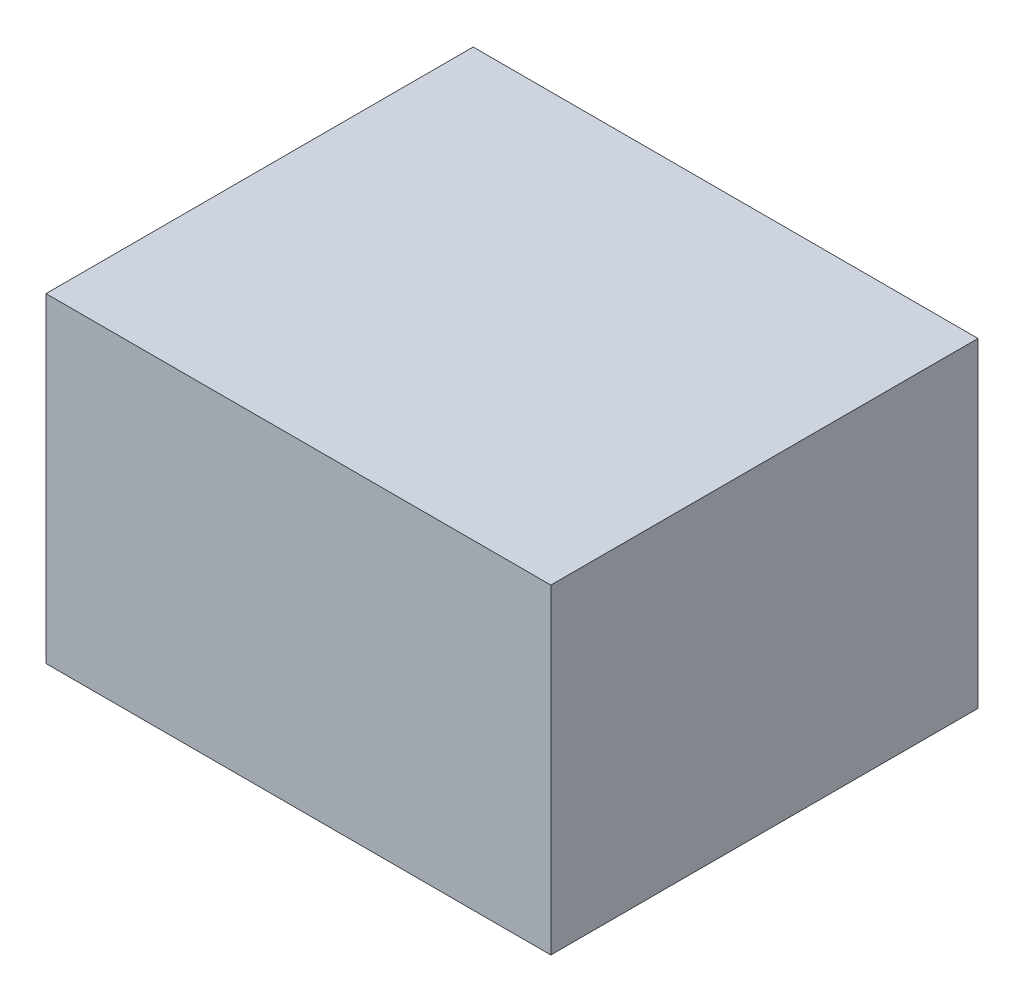
ISO-10303-21;
HEADER;
FILE_DESCRIPTION(('STEP AP214'),'2;1');
FILE_NAME('part.step','',(''),(''),'','','');
FILE_SCHEMA(('AUTOMOTIVE_DESIGN { 1 0 10303 214 1 1 1 1 }'));
ENDSEC;
DATA;
#1=APPLICATION_CONTEXT('core data for automotive mechanical design processes');
#2=APPLICATION_PROTOCOL_DEFINITION('international standard','automotive_design',2000,#1);
#3=PRODUCT_CONTEXT('',#1,'mechanical');
#4=PRODUCT('Part','Part','',(#3));
#5=PRODUCT_RELATED_PRODUCT_CATEGORY('part','',(#4));
#6=PRODUCT_DEFINITION_FORMATION('','',#4);
#7=PRODUCT_DEFINITION_CONTEXT('part definition',#1,'design');
#8=PRODUCT_DEFINITION('design','',#6,#7);
#9=PRODUCT_DEFINITION_SHAPE('','',#8);
#10=(LENGTH_UNIT() NAMED_UNIT(*) SI_UNIT(.MILLI.,.METRE.));
#11=(NAMED_UNIT(*) PLANE_ANGLE_UNIT() SI_UNIT($,.RADIAN.));
#12=(NAMED_UNIT(*) SI_UNIT($,.STERADIAN.) SOLID_ANGLE_UNIT());
#13=UNCERTAINTY_MEASURE_WITH_UNIT(LENGTH_MEASURE(1.E-05),#10,'distance_accuracy_value','');
#14=(GEOMETRIC_REPRESENTATION_CONTEXT(3) GLOBAL_UNCERTAINTY_ASSIGNED_CONTEXT((#13)) GLOBAL_UNIT_ASSIGNED_CONTEXT((#10,
#11,#12)) REPRESENTATION_CONTEXT('',''));
#15=CARTESIAN_POINT('',(0.,0.,0.));
#16=DIRECTION('',(0.,0.,1.));
#17=DIRECTION('',(1.,0.,0.));
#18=AXIS2_PLACEMENT_3D('',#15,#16,#17);
#19=CARTESIAN_POINT('',(0.,4.191,0.));
#20=DIRECTION('',(1.,0.,0.));
#21=DIRECTION('',(0.,0.,-1.));
#22=AXIS2_PLACEMENT_3D('',#19,#20,#21);
#23=PLANE('',#22);
#24=DIRECTION('',(0.,0.,1.));
#25=VECTOR('',#24,1.);
#26=CARTESIAN_POINT('',(0.,0.,0.));
#27=LINE('',#26,#25);
#28=CARTESIAN_POINT('',(0.,0.,-5.588));
#29=VERTEX_POINT('',#28);
#30=CARTESIAN_POINT('',(0.,0.,0.));
#31=VERTEX_POINT('',#30);
#32=EDGE_CURVE('E73',#29,#31,#27,.T.);
#33=ORIENTED_EDGE('',*,*,#32,.T.);
#34=DIRECTION('',(0.,-1.,0.));
#35=VECTOR('',#34,1.);
#36=CARTESIAN_POINT('',(0.,4.191,0.));
#37=LINE('',#36,#35);
#38=CARTESIAN_POINT('',(0.,4.191,0.));
#39=VERTEX_POINT('',#38);
#40=EDGE_CURVE('E11',#39,#31,#37,.T.);
#41=ORIENTED_EDGE('',*,*,#40,.F.);
#42=DIRECTION('',(0.,0.,1.));
#43=VECTOR('',#42,1.);
#44=CARTESIAN_POINT('',(0.,4.191,0.));
#45=LINE('',#44,#43);
#46=CARTESIAN_POINT('',(0.,4.191,-5.588));
#47=VERTEX_POINT('',#46);
#48=EDGE_CURVE('E91',#47,#39,#45,.T.);
#49=ORIENTED_EDGE('',*,*,#48,.F.);
#50=DIRECTION('',(0.,-1.,0.));
#51=VECTOR('',#50,1.);
#52=CARTESIAN_POINT('',(0.,4.191,-5.588));
#53=LINE('',#52,#51);
#54=EDGE_CURVE('E85',#47,#29,#53,.T.);
#55=ORIENTED_EDGE('',*,*,#54,.T.);
#56=EDGE_LOOP('',(#33,#41,#49,#55));
#57=FACE_BOUND('',#56,.T.);
#58=ADVANCED_FACE('F29',(#57),#23,.F.);
#59=CARTESIAN_POINT('',(0.,4.191,0.));
#60=DIRECTION('',(0.,0.,-1.));
#61=DIRECTION('',(-1.,0.,0.));
#62=AXIS2_PLACEMENT_3D('',#59,#60,#61);
#63=PLANE('',#62);
#64=DIRECTION('',(1.,0.,0.));
#65=VECTOR('',#64,1.);
#66=CARTESIAN_POINT('',(0.,0.,0.));
#67=LINE('',#66,#65);
#68=CARTESIAN_POINT('',(6.604,0.,0.));
#69=VERTEX_POINT('',#68);
#70=EDGE_CURVE('E69',#31,#69,#67,.T.);
#71=ORIENTED_EDGE('',*,*,#70,.T.);
#72=DIRECTION('',(0.,-1.,0.));
#73=VECTOR('',#72,1.);
#74=CARTESIAN_POINT('',(6.604,4.191,0.));
#75=LINE('',#74,#73);
#76=CARTESIAN_POINT('',(6.604,4.191,0.));
#77=VERTEX_POINT('',#76);
#78=EDGE_CURVE('E36',#77,#69,#75,.T.);
#79=ORIENTED_EDGE('',*,*,#78,.F.);
#80=DIRECTION('',(1.,0.,0.));
#81=VECTOR('',#80,1.);
#82=CARTESIAN_POINT('',(0.,4.191,0.));
#83=LINE('',#82,#81);
#84=EDGE_CURVE('E81',#39,#77,#83,.T.);
#85=ORIENTED_EDGE('',*,*,#84,.F.);
#86=ORIENTED_EDGE('',*,*,#40,.T.);
#87=EDGE_LOOP('',(#71,#79,#85,#86));
#88=FACE_BOUND('',#87,.T.);
#89=ADVANCED_FACE('F80',(#88),#63,.F.);
#90=CARTESIAN_POINT('',(6.604,4.191,0.));
#91=DIRECTION('',(-1.,0.,0.));
#92=DIRECTION('',(0.,0.,1.));
#93=AXIS2_PLACEMENT_3D('',#90,#91,#92);
#94=PLANE('',#93);
#95=DIRECTION('',(0.,0.,-1.));
#96=VECTOR('',#95,1.);
#97=CARTESIAN_POINT('',(6.604,0.,0.));
#98=LINE('',#97,#96);
#99=CARTESIAN_POINT('',(6.604,0.,-5.588));
#100=VERTEX_POINT('',#99);
#101=EDGE_CURVE('E74',#69,#100,#98,.T.);
#102=ORIENTED_EDGE('',*,*,#101,.T.);
#103=DIRECTION('',(0.,-1.,0.));
#104=VECTOR('',#103,1.);
#105=CARTESIAN_POINT('',(6.604,4.191,-5.588));
#106=LINE('',#105,#104);
#107=CARTESIAN_POINT('',(6.604,4.191,-5.588));
#108=VERTEX_POINT('',#107);
#109=EDGE_CURVE('E97',#108,#100,#106,.T.);
#110=ORIENTED_EDGE('',*,*,#109,.F.);
#111=DIRECTION('',(0.,0.,-1.));
#112=VECTOR('',#111,1.);
#113=CARTESIAN_POINT('',(6.604,4.191,0.));
#114=LINE('',#113,#112);
#115=EDGE_CURVE('E48',#77,#108,#114,.T.);
#116=ORIENTED_EDGE('',*,*,#115,.F.);
#117=ORIENTED_EDGE('',*,*,#78,.T.);
#118=EDGE_LOOP('',(#102,#110,#116,#117));
#119=FACE_BOUND('',#118,.T.);
#120=ADVANCED_FACE('F100',(#119),#94,.F.);
#121=CARTESIAN_POINT('',(0.,4.191,-5.588));
#122=DIRECTION('',(0.,0.,1.));
#123=DIRECTION('',(1.,0.,0.));
#124=AXIS2_PLACEMENT_3D('',#121,#122,#123);
#125=PLANE('',#124);
#126=DIRECTION('',(-1.,0.,0.));
#127=VECTOR('',#126,1.);
#128=CARTESIAN_POINT('',(0.,0.,-5.588));
#129=LINE('',#128,#127);
#130=EDGE_CURVE('E89',#100,#29,#129,.T.);
#131=ORIENTED_EDGE('',*,*,#130,.T.);
#132=ORIENTED_EDGE('',*,*,#54,.F.);
#133=DIRECTION('',(-1.,0.,0.));
#134=VECTOR('',#133,1.);
#135=CARTESIAN_POINT('',(0.,4.191,-5.588));
#136=LINE('',#135,#134);
#137=EDGE_CURVE('E43',#108,#47,#136,.T.);
#138=ORIENTED_EDGE('',*,*,#137,.F.);
#139=ORIENTED_EDGE('',*,*,#109,.T.);
#140=EDGE_LOOP('',(#131,#132,#138,#139));
#141=FACE_BOUND('',#140,.T.);
#142=ADVANCED_FACE('F102',(#141),#125,.F.);
#143=CARTESIAN_POINT('',(0.,4.191,-5.588));
#144=DIRECTION('',(0.,-1.,0.));
#145=DIRECTION('',(0.,0.,-1.));
#146=AXIS2_PLACEMENT_3D('',#143,#144,#145);
#147=PLANE('',#146);
#148=ORIENTED_EDGE('',*,*,#48,.T.);
#149=ORIENTED_EDGE('',*,*,#84,.T.);
#150=ORIENTED_EDGE('',*,*,#115,.T.);
#151=ORIENTED_EDGE('',*,*,#137,.T.);
#152=EDGE_LOOP('',(#148,#149,#150,#151));
#153=FACE_BOUND('',#152,.T.);
#154=ADVANCED_FACE('F103',(#153),#147,.F.);
#155=CARTESIAN_POINT('',(0.,0.,-5.588));
#156=DIRECTION('',(0.,-1.,0.));
#157=DIRECTION('',(0.,0.,-1.));
#158=AXIS2_PLACEMENT_3D('',#155,#156,#157);
#159=PLANE('',#158);
#160=ORIENTED_EDGE('',*,*,#32,.F.);
#161=ORIENTED_EDGE('',*,*,#130,.F.);
#162=ORIENTED_EDGE('',*,*,#101,.F.);
#163=ORIENTED_EDGE('',*,*,#70,.F.);
#164=EDGE_LOOP('',(#160,#161,#162,#163));
#165=FACE_BOUND('',#164,.T.);
#166=ADVANCED_FACE('F70',(#165),#159,.T.);
#167=CLOSED_SHELL('',(#58,#89,#120,#142,#154,#166));
#168=MANIFOLD_SOLID_BREP('B2',#167);
#169=ADVANCED_BREP_SHAPE_REPRESENTATION('',(#18,#168),#14);
#170=SHAPE_DEFINITION_REPRESENTATION(#9,#169);
ENDSEC;
END-ISO-10303-21;
